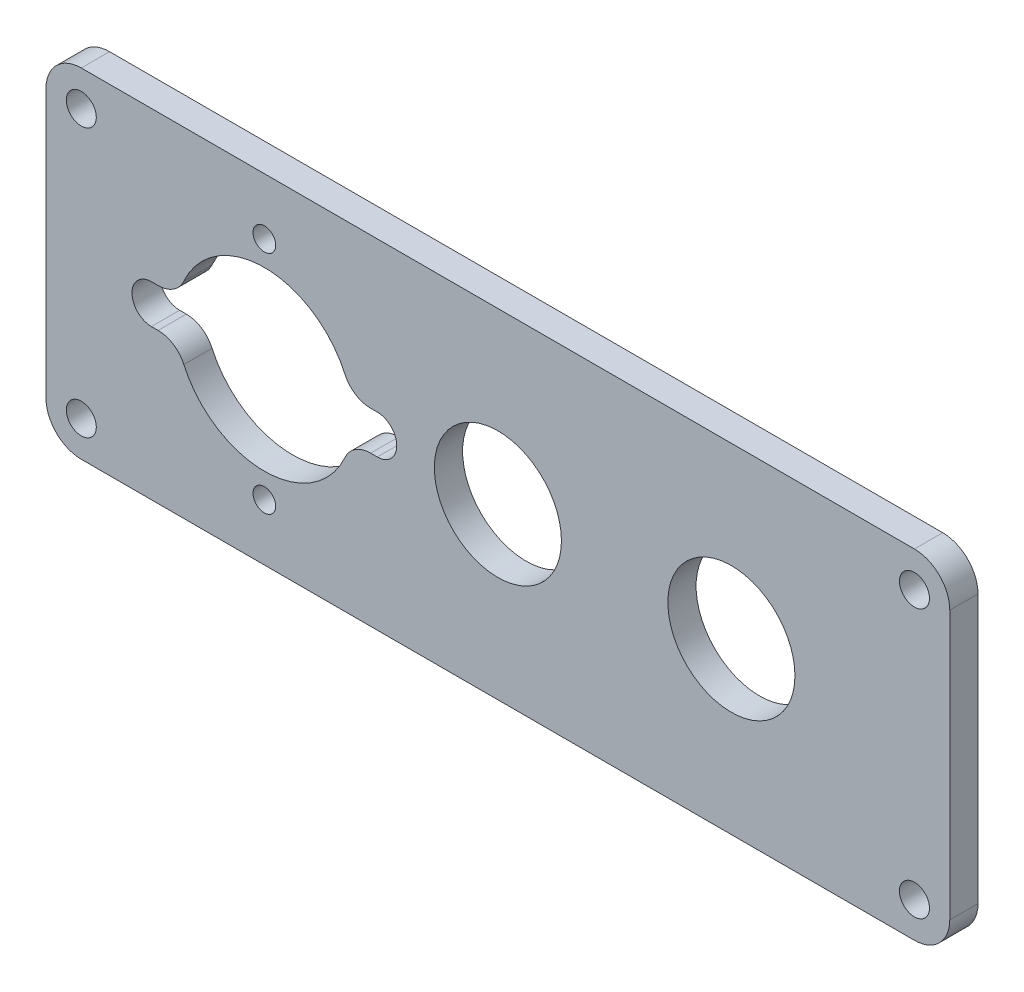
ISO-10303-21;
HEADER;
FILE_DESCRIPTION(('STEP AP214'),'2;1');
FILE_NAME('part.step','',(''),(''),'','','');
FILE_SCHEMA(('AUTOMOTIVE_DESIGN { 1 0 10303 214 1 1 1 1 }'));
ENDSEC;
DATA;
#1=APPLICATION_CONTEXT('core data for automotive mechanical design processes');
#2=APPLICATION_PROTOCOL_DEFINITION('international standard','automotive_design',2000,#1);
#3=PRODUCT_CONTEXT('',#1,'mechanical');
#4=PRODUCT('Part','Part','',(#3));
#5=PRODUCT_RELATED_PRODUCT_CATEGORY('part','',(#4));
#6=PRODUCT_DEFINITION_FORMATION('','',#4);
#7=PRODUCT_DEFINITION_CONTEXT('part definition',#1,'design');
#8=PRODUCT_DEFINITION('design','',#6,#7);
#9=PRODUCT_DEFINITION_SHAPE('','',#8);
#10=(LENGTH_UNIT() NAMED_UNIT(*) SI_UNIT(.MILLI.,.METRE.));
#11=(NAMED_UNIT(*) PLANE_ANGLE_UNIT() SI_UNIT($,.RADIAN.));
#12=(NAMED_UNIT(*) SI_UNIT($,.STERADIAN.) SOLID_ANGLE_UNIT());
#13=UNCERTAINTY_MEASURE_WITH_UNIT(LENGTH_MEASURE(1.E-05),#10,'distance_accuracy_value','');
#14=(GEOMETRIC_REPRESENTATION_CONTEXT(3) GLOBAL_UNCERTAINTY_ASSIGNED_CONTEXT((#13)) GLOBAL_UNIT_ASSIGNED_CONTEXT((#10,
#11,#12)) REPRESENTATION_CONTEXT('',''));
#15=CARTESIAN_POINT('',(0.,0.,0.));
#16=DIRECTION('',(0.,0.,1.));
#17=DIRECTION('',(1.,0.,0.));
#18=AXIS2_PLACEMENT_3D('',#15,#16,#17);
#19=CARTESIAN_POINT('',(-93.6625,-30.1625,6.35));
#20=DIRECTION('',(0.,0.,-1.));
#21=DIRECTION('',(-1.,0.,0.));
#22=AXIS2_PLACEMENT_3D('',#19,#20,#21);
#23=PLANE('',#22);
#24=CARTESIAN_POINT('',(-93.6625,-30.1625,6.35));
#25=DIRECTION('',(0.,0.,1.));
#26=DIRECTION('',(1.,0.,0.));
#27=AXIS2_PLACEMENT_3D('',#24,#25,#26);
#28=CIRCLE('',#27,3.3734375);
#29=CARTESIAN_POINT('',(-90.2890625,-30.1625,6.35));
#30=VERTEX_POINT('',#29);
#31=EDGE_CURVE('E317',#30,#30,#28,.T.);
#32=ORIENTED_EDGE('',*,*,#31,.F.);
#33=EDGE_LOOP('',(#32));
#34=FACE_BOUND('',#33,.T.);
#35=CARTESIAN_POINT('',(93.6625,-30.1625,6.35));
#36=DIRECTION('',(0.,0.,1.));
#37=DIRECTION('',(1.,0.,0.));
#38=AXIS2_PLACEMENT_3D('',#35,#36,#37);
#39=CIRCLE('',#38,3.3734375);
#40=CARTESIAN_POINT('',(97.0359375,-30.1625,6.35));
#41=VERTEX_POINT('',#40);
#42=EDGE_CURVE('E325',#41,#41,#39,.T.);
#43=ORIENTED_EDGE('',*,*,#42,.F.);
#44=EDGE_LOOP('',(#43));
#45=FACE_BOUND('',#44,.T.);
#46=CARTESIAN_POINT('',(93.6625,30.1625,6.35));
#47=DIRECTION('',(0.,0.,1.));
#48=DIRECTION('',(1.,0.,0.));
#49=AXIS2_PLACEMENT_3D('',#46,#47,#48);
#50=CIRCLE('',#49,3.3734375);
#51=CARTESIAN_POINT('',(97.0359375,30.1625,6.35));
#52=VERTEX_POINT('',#51);
#53=EDGE_CURVE('E333',#52,#52,#50,.T.);
#54=ORIENTED_EDGE('',*,*,#53,.F.);
#55=EDGE_LOOP('',(#54));
#56=FACE_BOUND('',#55,.T.);
#57=CARTESIAN_POINT('',(-93.6625,30.1625,6.35));
#58=DIRECTION('',(0.,0.,1.));
#59=DIRECTION('',(1.,0.,0.));
#60=AXIS2_PLACEMENT_3D('',#57,#58,#59);
#61=CIRCLE('',#60,3.3734375);
#62=CARTESIAN_POINT('',(-90.2890625,30.1625,6.35));
#63=VERTEX_POINT('',#62);
#64=EDGE_CURVE('E341',#63,#63,#61,.T.);
#65=ORIENTED_EDGE('',*,*,#64,.F.);
#66=EDGE_LOOP('',(#65));
#67=FACE_BOUND('',#66,.T.);
#68=CARTESIAN_POINT('',(52.5018,0.,6.35));
#69=DIRECTION('',(0.,0.,1.));
#70=DIRECTION('',(1.,0.,0.));
#71=AXIS2_PLACEMENT_3D('',#68,#69,#70);
#72=CIRCLE('',#71,14.2875);
#73=CARTESIAN_POINT('',(66.7893,0.,6.35));
#74=VERTEX_POINT('',#73);
#75=EDGE_CURVE('E349',#74,#74,#72,.T.);
#76=ORIENTED_EDGE('',*,*,#75,.F.);
#77=EDGE_LOOP('',(#76));
#78=FACE_BOUND('',#77,.T.);
#79=CARTESIAN_POINT('',(0.,0.,6.35));
#80=DIRECTION('',(0.,0.,1.));
#81=DIRECTION('',(1.,0.,0.));
#82=AXIS2_PLACEMENT_3D('',#79,#80,#81);
#83=CIRCLE('',#82,14.2875);
#84=CARTESIAN_POINT('',(14.2875,0.,6.35));
#85=VERTEX_POINT('',#84);
#86=EDGE_CURVE('E357',#85,#85,#83,.T.);
#87=ORIENTED_EDGE('',*,*,#86,.F.);
#88=EDGE_LOOP('',(#87));
#89=FACE_BOUND('',#88,.T.);
#90=CARTESIAN_POINT('',(-93.6625,-30.1625,6.35));
#91=DIRECTION('',(0.,0.,1.));
#92=DIRECTION('',(-1.,0.,0.));
#93=AXIS2_PLACEMENT_3D('',#90,#91,#92);
#94=CIRCLE('',#93,7.9375);
#95=CARTESIAN_POINT('',(-101.6,-30.1625,6.35));
#96=VERTEX_POINT('',#95);
#97=CARTESIAN_POINT('',(-93.6625,-38.1,6.35));
#98=VERTEX_POINT('',#97);
#99=EDGE_CURVE('E365',#96,#98,#94,.T.);
#100=ORIENTED_EDGE('',*,*,#99,.T.);
#101=DIRECTION('',(1.,0.,0.));
#102=VECTOR('',#101,1.);
#103=CARTESIAN_POINT('',(-93.6625,-38.1,6.35));
#104=LINE('',#103,#102);
#105=CARTESIAN_POINT('',(93.6625,-38.1,6.35));
#106=VERTEX_POINT('',#105);
#107=EDGE_CURVE('E369',#98,#106,#104,.T.);
#108=ORIENTED_EDGE('',*,*,#107,.T.);
#109=CARTESIAN_POINT('',(93.6625,-30.1625,6.35));
#110=DIRECTION('',(0.,0.,1.));
#111=DIRECTION('',(1.,0.,0.));
#112=AXIS2_PLACEMENT_3D('',#109,#110,#111);
#113=CIRCLE('',#112,7.93750000000001);
#114=CARTESIAN_POINT('',(101.6,-30.1625,6.35));
#115=VERTEX_POINT('',#114);
#116=EDGE_CURVE('E373',#106,#115,#113,.T.);
#117=ORIENTED_EDGE('',*,*,#116,.T.);
#118=DIRECTION('',(0.,1.,0.));
#119=VECTOR('',#118,1.);
#120=CARTESIAN_POINT('',(101.6,-30.1625,6.35));
#121=LINE('',#120,#119);
#122=CARTESIAN_POINT('',(101.6,30.1625,6.35));
#123=VERTEX_POINT('',#122);
#124=EDGE_CURVE('E376',#115,#123,#121,.T.);
#125=ORIENTED_EDGE('',*,*,#124,.T.);
#126=CARTESIAN_POINT('',(93.6625,30.1625,6.35));
#127=DIRECTION('',(0.,0.,1.));
#128=DIRECTION('',(-1.,0.,0.));
#129=AXIS2_PLACEMENT_3D('',#126,#127,#128);
#130=CIRCLE('',#129,7.93750000000001);
#131=CARTESIAN_POINT('',(93.6625,38.1,6.35));
#132=VERTEX_POINT('',#131);
#133=EDGE_CURVE('E379',#123,#132,#130,.T.);
#134=ORIENTED_EDGE('',*,*,#133,.T.);
#135=DIRECTION('',(-1.,0.,0.));
#136=VECTOR('',#135,1.);
#137=CARTESIAN_POINT('',(-93.6625,38.1,6.35));
#138=LINE('',#137,#136);
#139=CARTESIAN_POINT('',(-93.6625,38.1,6.35));
#140=VERTEX_POINT('',#139);
#141=EDGE_CURVE('E382',#132,#140,#138,.T.);
#142=ORIENTED_EDGE('',*,*,#141,.T.);
#143=CARTESIAN_POINT('',(-93.6625,30.1625,6.35));
#144=DIRECTION('',(0.,0.,1.));
#145=DIRECTION('',(-1.,0.,0.));
#146=AXIS2_PLACEMENT_3D('',#143,#144,#145);
#147=CIRCLE('',#146,7.9375);
#148=CARTESIAN_POINT('',(-101.6,30.1625,6.35));
#149=VERTEX_POINT('',#148);
#150=EDGE_CURVE('E385',#140,#149,#147,.T.);
#151=ORIENTED_EDGE('',*,*,#150,.T.);
#152=DIRECTION('',(0.,-1.,0.));
#153=VECTOR('',#152,1.);
#154=CARTESIAN_POINT('',(-101.6,-30.1625,6.35));
#155=LINE('',#154,#153);
#156=EDGE_CURVE('E388',#149,#96,#155,.T.);
#157=ORIENTED_EDGE('',*,*,#156,.T.);
#158=EDGE_LOOP('',(#100,#108,#117,#125,#134,#142,#151,#157));
#159=FACE_BOUND('',#158,.T.);
#160=CARTESIAN_POINT('',(-28.601593607115,-10.7188,6.35));
#161=DIRECTION('',(0.,0.,-1.));
#162=DIRECTION('',(1.,0.,0.));
#163=AXIS2_PLACEMENT_3D('',#160,#161,#162);
#164=CIRCLE('',#163,6.35);
#165=CARTESIAN_POINT('',(-34.3955830356932,-8.12030303030303,6.35));
#166=VERTEX_POINT('',#165);
#167=CARTESIAN_POINT('',(-28.601593607115,-4.36879999999999,6.35));
#168=VERTEX_POINT('',#167);
#169=EDGE_CURVE('E184',#166,#168,#164,.T.);
#170=ORIENTED_EDGE('',*,*,#169,.F.);
#171=CARTESIAN_POINT('',(-52.5018,0.,6.35));
#172=DIRECTION('',(0.,0.,1.));
#173=DIRECTION('',(1.,0.,0.));
#174=AXIS2_PLACEMENT_3D('',#171,#172,#173);
#175=CIRCLE('',#174,19.84375);
#176=CARTESIAN_POINT('',(-70.6080169643068,-8.12030303030303,6.35));
#177=VERTEX_POINT('',#176);
#178=EDGE_CURVE('E240',#177,#166,#175,.T.);
#179=ORIENTED_EDGE('',*,*,#178,.F.);
#180=CARTESIAN_POINT('',(-76.402006392885,-10.7188,6.35));
#181=DIRECTION('',(0.,0.,-1.));
#182=DIRECTION('',(-1.,0.,0.));
#183=AXIS2_PLACEMENT_3D('',#180,#181,#182);
#184=CIRCLE('',#183,6.35);
#185=CARTESIAN_POINT('',(-76.402006392885,-4.36880000000001,6.35));
#186=VERTEX_POINT('',#185);
#187=EDGE_CURVE('E237',#186,#177,#184,.T.);
#188=ORIENTED_EDGE('',*,*,#187,.F.);
#189=DIRECTION('',(1.,0.,0.));
#190=VECTOR('',#189,1.);
#191=CARTESIAN_POINT('',(-76.402006392885,-4.36880000000001,6.35));
#192=LINE('',#191,#190);
#193=CARTESIAN_POINT('',(-77.9018,-4.3688,6.35));
#194=VERTEX_POINT('',#193);
#195=EDGE_CURVE('E234',#194,#186,#192,.T.);
#196=ORIENTED_EDGE('',*,*,#195,.F.);
#197=CARTESIAN_POINT('',(-77.9018,0.,6.35));
#198=DIRECTION('',(0.,0.,1.));
#199=DIRECTION('',(1.,0.,0.));
#200=AXIS2_PLACEMENT_3D('',#197,#198,#199);
#201=CIRCLE('',#200,4.3688);
#202=CARTESIAN_POINT('',(-77.9018,4.3688,6.35));
#203=VERTEX_POINT('',#202);
#204=EDGE_CURVE('E231',#203,#194,#201,.T.);
#205=ORIENTED_EDGE('',*,*,#204,.F.);
#206=DIRECTION('',(-1.,0.,0.));
#207=VECTOR('',#206,1.);
#208=CARTESIAN_POINT('',(-76.402006392885,4.36879999999999,6.35));
#209=LINE('',#208,#207);
#210=CARTESIAN_POINT('',(-76.402006392885,4.36879999999999,6.35));
#211=VERTEX_POINT('',#210);
#212=EDGE_CURVE('E228',#211,#203,#209,.T.);
#213=ORIENTED_EDGE('',*,*,#212,.F.);
#214=CARTESIAN_POINT('',(-76.402006392885,10.7188,6.35));
#215=DIRECTION('',(0.,0.,-1.));
#216=DIRECTION('',(1.,0.,0.));
#217=AXIS2_PLACEMENT_3D('',#214,#215,#216);
#218=CIRCLE('',#217,6.34999999999999);
#219=CARTESIAN_POINT('',(-70.6080169643068,8.12030303030302,6.35));
#220=VERTEX_POINT('',#219);
#221=EDGE_CURVE('E225',#220,#211,#218,.T.);
#222=ORIENTED_EDGE('',*,*,#221,.F.);
#223=CARTESIAN_POINT('',(-52.5018,0.,6.35));
#224=DIRECTION('',(0.,0.,1.));
#225=DIRECTION('',(1.,0.,0.));
#226=AXIS2_PLACEMENT_3D('',#223,#224,#225);
#227=CIRCLE('',#226,19.84375);
#228=CARTESIAN_POINT('',(-34.3955830356932,8.12030303030304,6.35));
#229=VERTEX_POINT('',#228);
#230=EDGE_CURVE('E222',#229,#220,#227,.T.);
#231=ORIENTED_EDGE('',*,*,#230,.F.);
#232=CARTESIAN_POINT('',(-28.601593607115,10.7188,6.35));
#233=DIRECTION('',(0.,0.,-1.));
#234=DIRECTION('',(-1.,0.,0.));
#235=AXIS2_PLACEMENT_3D('',#232,#233,#234);
#236=CIRCLE('',#235,6.35);
#237=CARTESIAN_POINT('',(-28.601593607115,4.36880000000002,6.35));
#238=VERTEX_POINT('',#237);
#239=EDGE_CURVE('E219',#238,#229,#236,.T.);
#240=ORIENTED_EDGE('',*,*,#239,.F.);
#241=DIRECTION('',(-1.,0.,0.));
#242=VECTOR('',#241,1.);
#243=CARTESIAN_POINT('',(-28.601593607115,4.36880000000002,6.35));
#244=LINE('',#243,#242);
#245=CARTESIAN_POINT('',(-27.1018,4.3688,6.35));
#246=VERTEX_POINT('',#245);
#247=EDGE_CURVE('E213',#246,#238,#244,.T.);
#248=ORIENTED_EDGE('',*,*,#247,.F.);
#249=CARTESIAN_POINT('',(-27.1018,0.,6.35));
#250=DIRECTION('',(0.,0.,1.));
#251=DIRECTION('',(1.,0.,0.));
#252=AXIS2_PLACEMENT_3D('',#249,#250,#251);
#253=CIRCLE('',#252,4.3688);
#254=CARTESIAN_POINT('',(-27.1018,-4.3688,6.35));
#255=VERTEX_POINT('',#254);
#256=EDGE_CURVE('E208',#255,#246,#253,.T.);
#257=ORIENTED_EDGE('',*,*,#256,.F.);
#258=DIRECTION('',(1.,0.,0.));
#259=VECTOR('',#258,1.);
#260=CARTESIAN_POINT('',(-27.1018,-4.3688,6.35));
#261=LINE('',#260,#259);
#262=EDGE_CURVE('E193',#168,#255,#261,.T.);
#263=ORIENTED_EDGE('',*,*,#262,.F.);
#264=EDGE_LOOP('',(#170,#179,#188,#196,#205,#213,#222,#231,#240,#248,#257,#263));
#265=FACE_BOUND('',#264,.T.);
#266=CARTESIAN_POINT('',(-52.5018,25.4,6.35));
#267=DIRECTION('',(0.,0.,1.));
#268=DIRECTION('',(1.,0.,0.));
#269=AXIS2_PLACEMENT_3D('',#266,#267,#268);
#270=CIRCLE('',#269,2.55270000000001);
#271=CARTESIAN_POINT('',(-49.9491,25.4,6.35));
#272=VERTEX_POINT('',#271);
#273=EDGE_CURVE('E245',#272,#272,#270,.T.);
#274=ORIENTED_EDGE('',*,*,#273,.F.);
#275=EDGE_LOOP('',(#274));
#276=FACE_BOUND('',#275,.T.);
#277=CARTESIAN_POINT('',(-52.5018,-25.4,6.35));
#278=DIRECTION('',(0.,0.,1.));
#279=DIRECTION('',(1.,0.,0.));
#280=AXIS2_PLACEMENT_3D('',#277,#278,#279);
#281=CIRCLE('',#280,2.5527);
#282=CARTESIAN_POINT('',(-49.9491,-25.4,6.35));
#283=VERTEX_POINT('',#282);
#284=EDGE_CURVE('E593',#283,#283,#281,.T.);
#285=ORIENTED_EDGE('',*,*,#284,.F.);
#286=EDGE_LOOP('',(#285));
#287=FACE_BOUND('',#286,.T.);
#288=ADVANCED_FACE('F46',(#34,#45,#56,#67,#78,#89,#159,#265,#276,#287),#23,.F.);
#289=CARTESIAN_POINT('',(-93.6625,-30.1625,0.));
#290=DIRECTION('',(0.,0.,-1.));
#291=DIRECTION('',(-1.,0.,0.));
#292=AXIS2_PLACEMENT_3D('',#289,#290,#291);
#293=PLANE('',#292);
#294=CARTESIAN_POINT('',(-52.5018,25.4,0.));
#295=DIRECTION('',(0.,0.,1.));
#296=DIRECTION('',(1.,0.,0.));
#297=AXIS2_PLACEMENT_3D('',#294,#295,#296);
#298=CIRCLE('',#297,2.55270000000001);
#299=CARTESIAN_POINT('',(-49.9491,25.4,0.));
#300=VERTEX_POINT('',#299);
#301=EDGE_CURVE('E602',#300,#300,#298,.T.);
#302=ORIENTED_EDGE('',*,*,#301,.T.);
#303=EDGE_LOOP('',(#302));
#304=FACE_BOUND('',#303,.T.);
#305=CARTESIAN_POINT('',(93.6625,-30.1625,0.));
#306=DIRECTION('',(0.,0.,1.));
#307=DIRECTION('',(1.,0.,0.));
#308=AXIS2_PLACEMENT_3D('',#305,#306,#307);
#309=CIRCLE('',#308,3.3734375);
#310=CARTESIAN_POINT('',(97.0359375,-30.1625,0.));
#311=VERTEX_POINT('',#310);
#312=EDGE_CURVE('E321',#311,#311,#309,.T.);
#313=ORIENTED_EDGE('',*,*,#312,.T.);
#314=EDGE_LOOP('',(#313));
#315=FACE_BOUND('',#314,.T.);
#316=CARTESIAN_POINT('',(-93.6625,30.1625,0.));
#317=DIRECTION('',(0.,0.,1.));
#318=DIRECTION('',(1.,0.,0.));
#319=AXIS2_PLACEMENT_3D('',#316,#317,#318);
#320=CIRCLE('',#319,3.3734375);
#321=CARTESIAN_POINT('',(-90.2890625,30.1625,0.));
#322=VERTEX_POINT('',#321);
#323=EDGE_CURVE('E337',#322,#322,#320,.T.);
#324=ORIENTED_EDGE('',*,*,#323,.T.);
#325=EDGE_LOOP('',(#324));
#326=FACE_BOUND('',#325,.T.);
#327=CARTESIAN_POINT('',(0.,0.,0.));
#328=DIRECTION('',(0.,0.,1.));
#329=DIRECTION('',(1.,0.,0.));
#330=AXIS2_PLACEMENT_3D('',#327,#328,#329);
#331=CIRCLE('',#330,14.2875);
#332=CARTESIAN_POINT('',(14.2875,0.,0.));
#333=VERTEX_POINT('',#332);
#334=EDGE_CURVE('E353',#333,#333,#331,.T.);
#335=ORIENTED_EDGE('',*,*,#334,.T.);
#336=EDGE_LOOP('',(#335));
#337=FACE_BOUND('',#336,.T.);
#338=CARTESIAN_POINT('',(-93.6625,-30.1625,0.));
#339=DIRECTION('',(0.,0.,1.));
#340=DIRECTION('',(-1.,0.,0.));
#341=AXIS2_PLACEMENT_3D('',#338,#339,#340);
#342=CIRCLE('',#341,7.9375);
#343=CARTESIAN_POINT('',(-101.6,-30.1625,0.));
#344=VERTEX_POINT('',#343);
#345=CARTESIAN_POINT('',(-93.6625,-38.1,0.));
#346=VERTEX_POINT('',#345);
#347=EDGE_CURVE('E361',#344,#346,#342,.T.);
#348=ORIENTED_EDGE('',*,*,#347,.F.);
#349=DIRECTION('',(0.,-1.,0.));
#350=VECTOR('',#349,1.);
#351=CARTESIAN_POINT('',(-101.6,-30.1625,0.));
#352=LINE('',#351,#350);
#353=CARTESIAN_POINT('',(-101.6,30.1625,0.));
#354=VERTEX_POINT('',#353);
#355=EDGE_CURVE('E370',#354,#344,#352,.T.);
#356=ORIENTED_EDGE('',*,*,#355,.F.);
#357=CARTESIAN_POINT('',(-93.6625,30.1625,0.));
#358=DIRECTION('',(0.,0.,1.));
#359=DIRECTION('',(-1.,0.,0.));
#360=AXIS2_PLACEMENT_3D('',#357,#358,#359);
#361=CIRCLE('',#360,7.9375);
#362=CARTESIAN_POINT('',(-93.6625,38.1,0.));
#363=VERTEX_POINT('',#362);
#364=EDGE_CURVE('E410',#363,#354,#361,.T.);
#365=ORIENTED_EDGE('',*,*,#364,.F.);
#366=DIRECTION('',(-1.,0.,0.));
#367=VECTOR('',#366,1.);
#368=CARTESIAN_POINT('',(-93.6625,38.1,0.));
#369=LINE('',#368,#367);
#370=CARTESIAN_POINT('',(93.6625,38.1,0.));
#371=VERTEX_POINT('',#370);
#372=EDGE_CURVE('E407',#371,#363,#369,.T.);
#373=ORIENTED_EDGE('',*,*,#372,.F.);
#374=CARTESIAN_POINT('',(93.6625,30.1625,0.));
#375=DIRECTION('',(0.,0.,1.));
#376=DIRECTION('',(-1.,0.,0.));
#377=AXIS2_PLACEMENT_3D('',#374,#375,#376);
#378=CIRCLE('',#377,7.93750000000001);
#379=CARTESIAN_POINT('',(101.6,30.1625,0.));
#380=VERTEX_POINT('',#379);
#381=EDGE_CURVE('E404',#380,#371,#378,.T.);
#382=ORIENTED_EDGE('',*,*,#381,.F.);
#383=DIRECTION('',(0.,1.,0.));
#384=VECTOR('',#383,1.);
#385=CARTESIAN_POINT('',(101.6,-30.1625,0.));
#386=LINE('',#385,#384);
#387=CARTESIAN_POINT('',(101.6,-30.1625,0.));
#388=VERTEX_POINT('',#387);
#389=EDGE_CURVE('E401',#388,#380,#386,.T.);
#390=ORIENTED_EDGE('',*,*,#389,.F.);
#391=CARTESIAN_POINT('',(93.6625,-30.1625,0.));
#392=DIRECTION('',(0.,0.,1.));
#393=DIRECTION('',(1.,0.,0.));
#394=AXIS2_PLACEMENT_3D('',#391,#392,#393);
#395=CIRCLE('',#394,7.93750000000001);
#396=CARTESIAN_POINT('',(93.6625,-38.1,0.));
#397=VERTEX_POINT('',#396);
#398=EDGE_CURVE('E398',#397,#388,#395,.T.);
#399=ORIENTED_EDGE('',*,*,#398,.F.);
#400=DIRECTION('',(1.,0.,0.));
#401=VECTOR('',#400,1.);
#402=CARTESIAN_POINT('',(-93.6625,-38.1,0.));
#403=LINE('',#402,#401);
#404=EDGE_CURVE('E395',#346,#397,#403,.T.);
#405=ORIENTED_EDGE('',*,*,#404,.F.);
#406=EDGE_LOOP('',(#348,#356,#365,#373,#382,#390,#399,#405));
#407=FACE_BOUND('',#406,.T.);
#408=CARTESIAN_POINT('',(52.5018,0.,0.));
#409=DIRECTION('',(0.,0.,1.));
#410=DIRECTION('',(1.,0.,0.));
#411=AXIS2_PLACEMENT_3D('',#408,#409,#410);
#412=CIRCLE('',#411,14.2875);
#413=CARTESIAN_POINT('',(66.7893,0.,0.));
#414=VERTEX_POINT('',#413);
#415=EDGE_CURVE('E345',#414,#414,#412,.T.);
#416=ORIENTED_EDGE('',*,*,#415,.T.);
#417=EDGE_LOOP('',(#416));
#418=FACE_BOUND('',#417,.T.);
#419=CARTESIAN_POINT('',(93.6625,30.1625,0.));
#420=DIRECTION('',(0.,0.,1.));
#421=DIRECTION('',(1.,0.,0.));
#422=AXIS2_PLACEMENT_3D('',#419,#420,#421);
#423=CIRCLE('',#422,3.3734375);
#424=CARTESIAN_POINT('',(97.0359375,30.1625,0.));
#425=VERTEX_POINT('',#424);
#426=EDGE_CURVE('E329',#425,#425,#423,.T.);
#427=ORIENTED_EDGE('',*,*,#426,.T.);
#428=EDGE_LOOP('',(#427));
#429=FACE_BOUND('',#428,.T.);
#430=CARTESIAN_POINT('',(-93.6625,-30.1625,0.));
#431=DIRECTION('',(0.,0.,1.));
#432=DIRECTION('',(1.,0.,0.));
#433=AXIS2_PLACEMENT_3D('',#430,#431,#432);
#434=CIRCLE('',#433,3.3734375);
#435=CARTESIAN_POINT('',(-90.2890625,-30.1625,0.));
#436=VERTEX_POINT('',#435);
#437=EDGE_CURVE('E202',#436,#436,#434,.T.);
#438=ORIENTED_EDGE('',*,*,#437,.T.);
#439=EDGE_LOOP('',(#438));
#440=FACE_BOUND('',#439,.T.);
#441=CARTESIAN_POINT('',(-52.5018,0.,0.));
#442=DIRECTION('',(0.,0.,1.));
#443=DIRECTION('',(1.,0.,0.));
#444=AXIS2_PLACEMENT_3D('',#441,#442,#443);
#445=CIRCLE('',#444,19.84375);
#446=CARTESIAN_POINT('',(-70.6080169643068,-8.12030303030303,0.));
#447=VERTEX_POINT('',#446);
#448=CARTESIAN_POINT('',(-34.3955830356932,-8.12030303030303,0.));
#449=VERTEX_POINT('',#448);
#450=EDGE_CURVE('E194',#447,#449,#445,.T.);
#451=ORIENTED_EDGE('',*,*,#450,.T.);
#452=CARTESIAN_POINT('',(-28.601593607115,-10.7188,0.));
#453=DIRECTION('',(0.,0.,-1.));
#454=DIRECTION('',(1.,0.,0.));
#455=AXIS2_PLACEMENT_3D('',#452,#453,#454);
#456=CIRCLE('',#455,6.35);
#457=CARTESIAN_POINT('',(-28.601593607115,-4.36879999999999,0.));
#458=VERTEX_POINT('',#457);
#459=EDGE_CURVE('E70',#449,#458,#456,.T.);
#460=ORIENTED_EDGE('',*,*,#459,.T.);
#461=DIRECTION('',(1.,0.,0.));
#462=VECTOR('',#461,1.);
#463=CARTESIAN_POINT('',(-27.1018,-4.3688,0.));
#464=LINE('',#463,#462);
#465=CARTESIAN_POINT('',(-27.1018,-4.3688,0.));
#466=VERTEX_POINT('',#465);
#467=EDGE_CURVE('E200',#458,#466,#464,.T.);
#468=ORIENTED_EDGE('',*,*,#467,.T.);
#469=CARTESIAN_POINT('',(-27.1018,0.,0.));
#470=DIRECTION('',(0.,0.,1.));
#471=DIRECTION('',(1.,0.,0.));
#472=AXIS2_PLACEMENT_3D('',#469,#470,#471);
#473=CIRCLE('',#472,4.3688);
#474=CARTESIAN_POINT('',(-27.1018,4.3688,0.));
#475=VERTEX_POINT('',#474);
#476=EDGE_CURVE('E248',#466,#475,#473,.T.);
#477=ORIENTED_EDGE('',*,*,#476,.T.);
#478=DIRECTION('',(-1.,0.,0.));
#479=VECTOR('',#478,1.);
#480=CARTESIAN_POINT('',(-28.601593607115,4.36880000000002,0.));
#481=LINE('',#480,#479);
#482=CARTESIAN_POINT('',(-28.601593607115,4.36880000000002,0.));
#483=VERTEX_POINT('',#482);
#484=EDGE_CURVE('E252',#475,#483,#481,.T.);
#485=ORIENTED_EDGE('',*,*,#484,.T.);
#486=CARTESIAN_POINT('',(-28.601593607115,10.7188,0.));
#487=DIRECTION('',(0.,0.,-1.));
#488=DIRECTION('',(-1.,0.,0.));
#489=AXIS2_PLACEMENT_3D('',#486,#487,#488);
#490=CIRCLE('',#489,6.35);
#491=CARTESIAN_POINT('',(-34.3955830356932,8.12030303030304,0.));
#492=VERTEX_POINT('',#491);
#493=EDGE_CURVE('E256',#483,#492,#490,.T.);
#494=ORIENTED_EDGE('',*,*,#493,.T.);
#495=CARTESIAN_POINT('',(-52.5018,0.,0.));
#496=DIRECTION('',(0.,0.,1.));
#497=DIRECTION('',(1.,0.,0.));
#498=AXIS2_PLACEMENT_3D('',#495,#496,#497);
#499=CIRCLE('',#498,19.84375);
#500=CARTESIAN_POINT('',(-70.6080169643068,8.12030303030302,0.));
#501=VERTEX_POINT('',#500);
#502=EDGE_CURVE('E260',#492,#501,#499,.T.);
#503=ORIENTED_EDGE('',*,*,#502,.T.);
#504=CARTESIAN_POINT('',(-76.402006392885,10.7188,0.));
#505=DIRECTION('',(0.,0.,-1.));
#506=DIRECTION('',(1.,0.,0.));
#507=AXIS2_PLACEMENT_3D('',#504,#505,#506);
#508=CIRCLE('',#507,6.34999999999999);
#509=CARTESIAN_POINT('',(-76.402006392885,4.36879999999999,0.));
#510=VERTEX_POINT('',#509);
#511=EDGE_CURVE('E264',#501,#510,#508,.T.);
#512=ORIENTED_EDGE('',*,*,#511,.T.);
#513=DIRECTION('',(-1.,0.,0.));
#514=VECTOR('',#513,1.);
#515=CARTESIAN_POINT('',(-76.402006392885,4.36879999999999,0.));
#516=LINE('',#515,#514);
#517=CARTESIAN_POINT('',(-77.9018,4.3688,0.));
#518=VERTEX_POINT('',#517);
#519=EDGE_CURVE('E268',#510,#518,#516,.T.);
#520=ORIENTED_EDGE('',*,*,#519,.T.);
#521=CARTESIAN_POINT('',(-77.9018,0.,0.));
#522=DIRECTION('',(0.,0.,1.));
#523=DIRECTION('',(1.,0.,0.));
#524=AXIS2_PLACEMENT_3D('',#521,#522,#523);
#525=CIRCLE('',#524,4.3688);
#526=CARTESIAN_POINT('',(-77.9018,-4.3688,0.));
#527=VERTEX_POINT('',#526);
#528=EDGE_CURVE('E272',#518,#527,#525,.T.);
#529=ORIENTED_EDGE('',*,*,#528,.T.);
#530=DIRECTION('',(1.,0.,0.));
#531=VECTOR('',#530,1.);
#532=CARTESIAN_POINT('',(-76.402006392885,-4.36880000000001,0.));
#533=LINE('',#532,#531);
#534=CARTESIAN_POINT('',(-76.402006392885,-4.36880000000001,0.));
#535=VERTEX_POINT('',#534);
#536=EDGE_CURVE('E276',#527,#535,#533,.T.);
#537=ORIENTED_EDGE('',*,*,#536,.T.);
#538=CARTESIAN_POINT('',(-76.402006392885,-10.7188,0.));
#539=DIRECTION('',(0.,0.,-1.));
#540=DIRECTION('',(-1.,0.,0.));
#541=AXIS2_PLACEMENT_3D('',#538,#539,#540);
#542=CIRCLE('',#541,6.35);
#543=EDGE_CURVE('E280',#535,#447,#542,.T.);
#544=ORIENTED_EDGE('',*,*,#543,.T.);
#545=EDGE_LOOP('',(#451,#460,#468,#477,#485,#494,#503,#512,#520,#529,#537,#544));
#546=FACE_BOUND('',#545,.T.);
#547=CARTESIAN_POINT('',(-52.5018,-25.4,0.));
#548=DIRECTION('',(0.,0.,1.));
#549=DIRECTION('',(1.,0.,0.));
#550=AXIS2_PLACEMENT_3D('',#547,#548,#549);
#551=CIRCLE('',#550,2.5527);
#552=CARTESIAN_POINT('',(-49.9491,-25.4,0.));
#553=VERTEX_POINT('',#552);
#554=EDGE_CURVE('E596',#553,#553,#551,.T.);
#555=ORIENTED_EDGE('',*,*,#554,.T.);
#556=EDGE_LOOP('',(#555));
#557=FACE_BOUND('',#556,.T.);
#558=ADVANCED_FACE('F450',(#304,#315,#326,#337,#407,#418,#429,#440,#546,#557),#293,.T.);
#559=CARTESIAN_POINT('',(-93.6625,-30.1625,6.35));
#560=DIRECTION('',(0.,0.,-1.));
#561=DIRECTION('',(-1.,0.,0.));
#562=AXIS2_PLACEMENT_3D('',#559,#560,#561);
#563=CYLINDRICAL_SURFACE('',#562,7.9375);
#564=ORIENTED_EDGE('',*,*,#347,.T.);
#565=DIRECTION('',(0.,0.,-1.));
#566=VECTOR('',#565,1.);
#567=CARTESIAN_POINT('',(-93.6625,-38.1,6.35));
#568=LINE('',#567,#566);
#569=EDGE_CURVE('E13',#98,#346,#568,.T.);
#570=ORIENTED_EDGE('',*,*,#569,.F.);
#571=ORIENTED_EDGE('',*,*,#99,.F.);
#572=DIRECTION('',(0.,0.,-1.));
#573=VECTOR('',#572,1.);
#574=CARTESIAN_POINT('',(-101.6,-30.1625,6.35));
#575=LINE('',#574,#573);
#576=EDGE_CURVE('E391',#96,#344,#575,.T.);
#577=ORIENTED_EDGE('',*,*,#576,.T.);
#578=EDGE_LOOP('',(#564,#570,#571,#577));
#579=FACE_BOUND('',#578,.T.);
#580=ADVANCED_FACE('F48',(#579),#563,.T.);
#581=CARTESIAN_POINT('',(-93.6625,-38.1,6.35));
#582=DIRECTION('',(0.,1.,0.));
#583=DIRECTION('',(0.,0.,1.));
#584=AXIS2_PLACEMENT_3D('',#581,#582,#583);
#585=PLANE('',#584);
#586=ORIENTED_EDGE('',*,*,#404,.T.);
#587=DIRECTION('',(0.,0.,-1.));
#588=VECTOR('',#587,1.);
#589=CARTESIAN_POINT('',(93.6625,-38.1,6.35));
#590=LINE('',#589,#588);
#591=EDGE_CURVE('E55',#106,#397,#590,.T.);
#592=ORIENTED_EDGE('',*,*,#591,.F.);
#593=ORIENTED_EDGE('',*,*,#107,.F.);
#594=ORIENTED_EDGE('',*,*,#569,.T.);
#595=EDGE_LOOP('',(#586,#592,#593,#594));
#596=FACE_BOUND('',#595,.T.);
#597=ADVANCED_FACE('F467',(#596),#585,.F.);
#598=CARTESIAN_POINT('',(93.6625,-30.1625,6.35));
#599=DIRECTION('',(0.,0.,-1.));
#600=DIRECTION('',(-1.,0.,0.));
#601=AXIS2_PLACEMENT_3D('',#598,#599,#600);
#602=CYLINDRICAL_SURFACE('',#601,7.93750000000001);
#603=ORIENTED_EDGE('',*,*,#398,.T.);
#604=DIRECTION('',(0.,0.,-1.));
#605=VECTOR('',#604,1.);
#606=CARTESIAN_POINT('',(101.6,-30.1625,6.35));
#607=LINE('',#606,#605);
#608=EDGE_CURVE('E434',#115,#388,#607,.T.);
#609=ORIENTED_EDGE('',*,*,#608,.F.);
#610=ORIENTED_EDGE('',*,*,#116,.F.);
#611=ORIENTED_EDGE('',*,*,#591,.T.);
#612=EDGE_LOOP('',(#603,#609,#610,#611));
#613=FACE_BOUND('',#612,.T.);
#614=ADVANCED_FACE('F444',(#613),#602,.T.);
#615=CARTESIAN_POINT('',(101.6,-30.1625,6.35));
#616=DIRECTION('',(-1.,0.,0.));
#617=DIRECTION('',(0.,0.,1.));
#618=AXIS2_PLACEMENT_3D('',#615,#616,#617);
#619=PLANE('',#618);
#620=ORIENTED_EDGE('',*,*,#389,.T.);
#621=DIRECTION('',(0.,0.,-1.));
#622=VECTOR('',#621,1.);
#623=CARTESIAN_POINT('',(101.6,30.1625,6.35));
#624=LINE('',#623,#622);
#625=EDGE_CURVE('E430',#123,#380,#624,.T.);
#626=ORIENTED_EDGE('',*,*,#625,.F.);
#627=ORIENTED_EDGE('',*,*,#124,.F.);
#628=ORIENTED_EDGE('',*,*,#608,.T.);
#629=EDGE_LOOP('',(#620,#626,#627,#628));
#630=FACE_BOUND('',#629,.T.);
#631=ADVANCED_FACE('F456',(#630),#619,.F.);
#632=CARTESIAN_POINT('',(93.6625,30.1625,6.35));
#633=DIRECTION('',(0.,0.,-1.));
#634=DIRECTION('',(-1.,0.,0.));
#635=AXIS2_PLACEMENT_3D('',#632,#633,#634);
#636=CYLINDRICAL_SURFACE('',#635,7.93750000000001);
#637=ORIENTED_EDGE('',*,*,#381,.T.);
#638=DIRECTION('',(0.,0.,-1.));
#639=VECTOR('',#638,1.);
#640=CARTESIAN_POINT('',(93.6625,38.1,6.35));
#641=LINE('',#640,#639);
#642=EDGE_CURVE('E426',#132,#371,#641,.T.);
#643=ORIENTED_EDGE('',*,*,#642,.F.);
#644=ORIENTED_EDGE('',*,*,#133,.F.);
#645=ORIENTED_EDGE('',*,*,#625,.T.);
#646=EDGE_LOOP('',(#637,#643,#644,#645));
#647=FACE_BOUND('',#646,.T.);
#648=ADVANCED_FACE('F460',(#647),#636,.T.);
#649=CARTESIAN_POINT('',(-93.6625,38.1,6.35));
#650=DIRECTION('',(0.,-1.,0.));
#651=DIRECTION('',(0.,0.,-1.));
#652=AXIS2_PLACEMENT_3D('',#649,#650,#651);
#653=PLANE('',#652);
#654=ORIENTED_EDGE('',*,*,#372,.T.);
#655=DIRECTION('',(0.,0.,-1.));
#656=VECTOR('',#655,1.);
#657=CARTESIAN_POINT('',(-93.6625,38.1,6.35));
#658=LINE('',#657,#656);
#659=EDGE_CURVE('E422',#140,#363,#658,.T.);
#660=ORIENTED_EDGE('',*,*,#659,.F.);
#661=ORIENTED_EDGE('',*,*,#141,.F.);
#662=ORIENTED_EDGE('',*,*,#642,.T.);
#663=EDGE_LOOP('',(#654,#660,#661,#662));
#664=FACE_BOUND('',#663,.T.);
#665=ADVANCED_FACE('F480',(#664),#653,.F.);
#666=CARTESIAN_POINT('',(-93.6625,30.1625,6.35));
#667=DIRECTION('',(0.,0.,-1.));
#668=DIRECTION('',(-1.,0.,0.));
#669=AXIS2_PLACEMENT_3D('',#666,#667,#668);
#670=CYLINDRICAL_SURFACE('',#669,7.9375);
#671=ORIENTED_EDGE('',*,*,#364,.T.);
#672=DIRECTION('',(0.,0.,-1.));
#673=VECTOR('',#672,1.);
#674=CARTESIAN_POINT('',(-101.6,30.1625,6.35));
#675=LINE('',#674,#673);
#676=EDGE_CURVE('E418',#149,#354,#675,.T.);
#677=ORIENTED_EDGE('',*,*,#676,.F.);
#678=ORIENTED_EDGE('',*,*,#150,.F.);
#679=ORIENTED_EDGE('',*,*,#659,.T.);
#680=EDGE_LOOP('',(#671,#677,#678,#679));
#681=FACE_BOUND('',#680,.T.);
#682=ADVANCED_FACE('F478',(#681),#670,.T.);
#683=CARTESIAN_POINT('',(-101.6,-30.1625,6.35));
#684=DIRECTION('',(1.,0.,0.));
#685=DIRECTION('',(0.,0.,-1.));
#686=AXIS2_PLACEMENT_3D('',#683,#684,#685);
#687=PLANE('',#686);
#688=ORIENTED_EDGE('',*,*,#355,.T.);
#689=ORIENTED_EDGE('',*,*,#576,.F.);
#690=ORIENTED_EDGE('',*,*,#156,.F.);
#691=ORIENTED_EDGE('',*,*,#676,.T.);
#692=EDGE_LOOP('',(#688,#689,#690,#691));
#693=FACE_BOUND('',#692,.T.);
#694=ADVANCED_FACE('F473',(#693),#687,.F.);
#695=CARTESIAN_POINT('',(0.,0.,6.35));
#696=DIRECTION('',(0.,0.,-1.));
#697=DIRECTION('',(-1.,0.,0.));
#698=AXIS2_PLACEMENT_3D('',#695,#696,#697);
#699=CYLINDRICAL_SURFACE('',#698,14.2875);
#700=ORIENTED_EDGE('',*,*,#86,.T.);
#701=EDGE_LOOP('',(#700));
#702=FACE_BOUND('',#701,.T.);
#703=ORIENTED_EDGE('',*,*,#334,.F.);
#704=EDGE_LOOP('',(#703));
#705=FACE_BOUND('',#704,.T.);
#706=ADVANCED_FACE('F500',(#702,#705),#699,.F.);
#707=CARTESIAN_POINT('',(52.5018,0.,6.35));
#708=DIRECTION('',(0.,0.,-1.));
#709=DIRECTION('',(-1.,0.,0.));
#710=AXIS2_PLACEMENT_3D('',#707,#708,#709);
#711=CYLINDRICAL_SURFACE('',#710,14.2875);
#712=ORIENTED_EDGE('',*,*,#75,.T.);
#713=EDGE_LOOP('',(#712));
#714=FACE_BOUND('',#713,.T.);
#715=ORIENTED_EDGE('',*,*,#415,.F.);
#716=EDGE_LOOP('',(#715));
#717=FACE_BOUND('',#716,.T.);
#718=ADVANCED_FACE('F507',(#714,#717),#711,.F.);
#719=CARTESIAN_POINT('',(-93.6625,30.1625,6.35));
#720=DIRECTION('',(0.,0.,-1.));
#721=DIRECTION('',(-1.,0.,0.));
#722=AXIS2_PLACEMENT_3D('',#719,#720,#721);
#723=CYLINDRICAL_SURFACE('',#722,3.3734375);
#724=ORIENTED_EDGE('',*,*,#64,.T.);
#725=EDGE_LOOP('',(#724));
#726=FACE_BOUND('',#725,.T.);
#727=ORIENTED_EDGE('',*,*,#323,.F.);
#728=EDGE_LOOP('',(#727));
#729=FACE_BOUND('',#728,.T.);
#730=ADVANCED_FACE('F512',(#726,#729),#723,.F.);
#731=CARTESIAN_POINT('',(93.6625,30.1625,6.35));
#732=DIRECTION('',(0.,0.,-1.));
#733=DIRECTION('',(-1.,0.,0.));
#734=AXIS2_PLACEMENT_3D('',#731,#732,#733);
#735=CYLINDRICAL_SURFACE('',#734,3.3734375);
#736=ORIENTED_EDGE('',*,*,#53,.T.);
#737=EDGE_LOOP('',(#736));
#738=FACE_BOUND('',#737,.T.);
#739=ORIENTED_EDGE('',*,*,#426,.F.);
#740=EDGE_LOOP('',(#739));
#741=FACE_BOUND('',#740,.T.);
#742=ADVANCED_FACE('F522',(#738,#741),#735,.F.);
#743=CARTESIAN_POINT('',(93.6625,-30.1625,6.35));
#744=DIRECTION('',(0.,0.,-1.));
#745=DIRECTION('',(-1.,0.,0.));
#746=AXIS2_PLACEMENT_3D('',#743,#744,#745);
#747=CYLINDRICAL_SURFACE('',#746,3.3734375);
#748=ORIENTED_EDGE('',*,*,#42,.T.);
#749=EDGE_LOOP('',(#748));
#750=FACE_BOUND('',#749,.T.);
#751=ORIENTED_EDGE('',*,*,#312,.F.);
#752=EDGE_LOOP('',(#751));
#753=FACE_BOUND('',#752,.T.);
#754=ADVANCED_FACE('F529',(#750,#753),#747,.F.);
#755=CARTESIAN_POINT('',(-93.6625,-30.1625,6.35));
#756=DIRECTION('',(0.,0.,-1.));
#757=DIRECTION('',(-1.,0.,0.));
#758=AXIS2_PLACEMENT_3D('',#755,#756,#757);
#759=CYLINDRICAL_SURFACE('',#758,3.3734375);
#760=ORIENTED_EDGE('',*,*,#31,.T.);
#761=EDGE_LOOP('',(#760));
#762=FACE_BOUND('',#761,.T.);
#763=ORIENTED_EDGE('',*,*,#437,.F.);
#764=EDGE_LOOP('',(#763));
#765=FACE_BOUND('',#764,.T.);
#766=ADVANCED_FACE('F533',(#762,#765),#759,.F.);
#767=CARTESIAN_POINT('',(-28.601593607115,-10.7188,6.35));
#768=DIRECTION('',(0.,0.,-1.));
#769=DIRECTION('',(-1.,0.,0.));
#770=AXIS2_PLACEMENT_3D('',#767,#768,#769);
#771=CYLINDRICAL_SURFACE('',#770,6.35);
#772=ORIENTED_EDGE('',*,*,#459,.F.);
#773=DIRECTION('',(0.,0.,-1.));
#774=VECTOR('',#773,1.);
#775=CARTESIAN_POINT('',(-34.3955830356932,-8.12030303030303,6.35));
#776=LINE('',#775,#774);
#777=EDGE_CURVE('E188',#166,#449,#776,.T.);
#778=ORIENTED_EDGE('',*,*,#777,.F.);
#779=ORIENTED_EDGE('',*,*,#169,.T.);
#780=DIRECTION('',(0.,0.,-1.));
#781=VECTOR('',#780,1.);
#782=CARTESIAN_POINT('',(-28.601593607115,-4.36879999999999,6.35));
#783=LINE('',#782,#781);
#784=EDGE_CURVE('E187',#168,#458,#783,.T.);
#785=ORIENTED_EDGE('',*,*,#784,.T.);
#786=EDGE_LOOP('',(#772,#778,#779,#785));
#787=FACE_BOUND('',#786,.T.);
#788=ADVANCED_FACE('F186',(#787),#771,.T.);
#789=CARTESIAN_POINT('',(-27.1018,-4.3688,6.35));
#790=DIRECTION('',(0.,1.,0.));
#791=DIRECTION('',(-1.,0.,0.));
#792=AXIS2_PLACEMENT_3D('',#789,#790,#791);
#793=PLANE('',#792);
#794=ORIENTED_EDGE('',*,*,#467,.F.);
#795=ORIENTED_EDGE('',*,*,#784,.F.);
#796=ORIENTED_EDGE('',*,*,#262,.T.);
#797=DIRECTION('',(0.,0.,-1.));
#798=VECTOR('',#797,1.);
#799=CARTESIAN_POINT('',(-27.1018,-4.3688,6.35));
#800=LINE('',#799,#798);
#801=EDGE_CURVE('E203',#255,#466,#800,.T.);
#802=ORIENTED_EDGE('',*,*,#801,.T.);
#803=EDGE_LOOP('',(#794,#795,#796,#802));
#804=FACE_BOUND('',#803,.T.);
#805=ADVANCED_FACE('F197',(#804),#793,.T.);
#806=CARTESIAN_POINT('',(-27.1018,0.,6.35));
#807=DIRECTION('',(0.,0.,-1.));
#808=DIRECTION('',(-1.,0.,0.));
#809=AXIS2_PLACEMENT_3D('',#806,#807,#808);
#810=CYLINDRICAL_SURFACE('',#809,4.3688);
#811=ORIENTED_EDGE('',*,*,#476,.F.);
#812=ORIENTED_EDGE('',*,*,#801,.F.);
#813=ORIENTED_EDGE('',*,*,#256,.T.);
#814=DIRECTION('',(0.,0.,-1.));
#815=VECTOR('',#814,1.);
#816=CARTESIAN_POINT('',(-27.1018,4.3688,6.35));
#817=LINE('',#816,#815);
#818=EDGE_CURVE('E312',#246,#475,#817,.T.);
#819=ORIENTED_EDGE('',*,*,#818,.T.);
#820=EDGE_LOOP('',(#811,#812,#813,#819));
#821=FACE_BOUND('',#820,.T.);
#822=ADVANCED_FACE('F542',(#821),#810,.F.);
#823=CARTESIAN_POINT('',(-28.601593607115,4.36880000000002,6.35));
#824=DIRECTION('',(0.,-1.,0.));
#825=DIRECTION('',(1.,0.,0.));
#826=AXIS2_PLACEMENT_3D('',#823,#824,#825);
#827=PLANE('',#826);
#828=ORIENTED_EDGE('',*,*,#484,.F.);
#829=ORIENTED_EDGE('',*,*,#818,.F.);
#830=ORIENTED_EDGE('',*,*,#247,.T.);
#831=DIRECTION('',(0.,0.,-1.));
#832=VECTOR('',#831,1.);
#833=CARTESIAN_POINT('',(-28.601593607115,4.36880000000002,6.35));
#834=LINE('',#833,#832);
#835=EDGE_CURVE('E309',#238,#483,#834,.T.);
#836=ORIENTED_EDGE('',*,*,#835,.T.);
#837=EDGE_LOOP('',(#828,#829,#830,#836));
#838=FACE_BOUND('',#837,.T.);
#839=ADVANCED_FACE('F545',(#838),#827,.T.);
#840=CARTESIAN_POINT('',(-28.601593607115,10.7188,6.35));
#841=DIRECTION('',(0.,0.,-1.));
#842=DIRECTION('',(-1.,0.,0.));
#843=AXIS2_PLACEMENT_3D('',#840,#841,#842);
#844=CYLINDRICAL_SURFACE('',#843,6.35);
#845=ORIENTED_EDGE('',*,*,#493,.F.);
#846=ORIENTED_EDGE('',*,*,#835,.F.);
#847=ORIENTED_EDGE('',*,*,#239,.T.);
#848=DIRECTION('',(0.,0.,-1.));
#849=VECTOR('',#848,1.);
#850=CARTESIAN_POINT('',(-34.3955830356932,8.12030303030304,6.35));
#851=LINE('',#850,#849);
#852=EDGE_CURVE('E306',#229,#492,#851,.T.);
#853=ORIENTED_EDGE('',*,*,#852,.T.);
#854=EDGE_LOOP('',(#845,#846,#847,#853));
#855=FACE_BOUND('',#854,.T.);
#856=ADVANCED_FACE('F549',(#855),#844,.T.);
#857=CARTESIAN_POINT('',(-52.5018,0.,6.35));
#858=DIRECTION('',(0.,0.,-1.));
#859=DIRECTION('',(-1.,0.,0.));
#860=AXIS2_PLACEMENT_3D('',#857,#858,#859);
#861=CYLINDRICAL_SURFACE('',#860,19.84375);
#862=ORIENTED_EDGE('',*,*,#502,.F.);
#863=ORIENTED_EDGE('',*,*,#852,.F.);
#864=ORIENTED_EDGE('',*,*,#230,.T.);
#865=DIRECTION('',(0.,0.,-1.));
#866=VECTOR('',#865,1.);
#867=CARTESIAN_POINT('',(-70.6080169643068,8.12030303030302,6.35));
#868=LINE('',#867,#866);
#869=EDGE_CURVE('E303',#220,#501,#868,.T.);
#870=ORIENTED_EDGE('',*,*,#869,.T.);
#871=EDGE_LOOP('',(#862,#863,#864,#870));
#872=FACE_BOUND('',#871,.T.);
#873=ADVANCED_FACE('F553',(#872),#861,.F.);
#874=CARTESIAN_POINT('',(-76.402006392885,10.7188,6.35));
#875=DIRECTION('',(0.,0.,-1.));
#876=DIRECTION('',(-1.,0.,0.));
#877=AXIS2_PLACEMENT_3D('',#874,#875,#876);
#878=CYLINDRICAL_SURFACE('',#877,6.34999999999999);
#879=ORIENTED_EDGE('',*,*,#511,.F.);
#880=ORIENTED_EDGE('',*,*,#869,.F.);
#881=ORIENTED_EDGE('',*,*,#221,.T.);
#882=DIRECTION('',(0.,0.,-1.));
#883=VECTOR('',#882,1.);
#884=CARTESIAN_POINT('',(-76.402006392885,4.36879999999999,6.35));
#885=LINE('',#884,#883);
#886=EDGE_CURVE('E300',#211,#510,#885,.T.);
#887=ORIENTED_EDGE('',*,*,#886,.T.);
#888=EDGE_LOOP('',(#879,#880,#881,#887));
#889=FACE_BOUND('',#888,.T.);
#890=ADVANCED_FACE('F557',(#889),#878,.T.);
#891=CARTESIAN_POINT('',(-76.402006392885,4.36879999999999,6.35));
#892=DIRECTION('',(0.,-1.,0.));
#893=DIRECTION('',(1.,0.,0.));
#894=AXIS2_PLACEMENT_3D('',#891,#892,#893);
#895=PLANE('',#894);
#896=ORIENTED_EDGE('',*,*,#519,.F.);
#897=ORIENTED_EDGE('',*,*,#886,.F.);
#898=ORIENTED_EDGE('',*,*,#212,.T.);
#899=DIRECTION('',(0.,0.,-1.));
#900=VECTOR('',#899,1.);
#901=CARTESIAN_POINT('',(-77.9018,4.3688,6.35));
#902=LINE('',#901,#900);
#903=EDGE_CURVE('E297',#203,#518,#902,.T.);
#904=ORIENTED_EDGE('',*,*,#903,.T.);
#905=EDGE_LOOP('',(#896,#897,#898,#904));
#906=FACE_BOUND('',#905,.T.);
#907=ADVANCED_FACE('F561',(#906),#895,.T.);
#908=CARTESIAN_POINT('',(-77.9018,0.,6.35));
#909=DIRECTION('',(0.,0.,-1.));
#910=DIRECTION('',(-1.,0.,0.));
#911=AXIS2_PLACEMENT_3D('',#908,#909,#910);
#912=CYLINDRICAL_SURFACE('',#911,4.3688);
#913=ORIENTED_EDGE('',*,*,#528,.F.);
#914=ORIENTED_EDGE('',*,*,#903,.F.);
#915=ORIENTED_EDGE('',*,*,#204,.T.);
#916=DIRECTION('',(0.,0.,-1.));
#917=VECTOR('',#916,1.);
#918=CARTESIAN_POINT('',(-77.9018,-4.3688,6.35));
#919=LINE('',#918,#917);
#920=EDGE_CURVE('E294',#194,#527,#919,.T.);
#921=ORIENTED_EDGE('',*,*,#920,.T.);
#922=EDGE_LOOP('',(#913,#914,#915,#921));
#923=FACE_BOUND('',#922,.T.);
#924=ADVANCED_FACE('F565',(#923),#912,.F.);
#925=CARTESIAN_POINT('',(-76.402006392885,-4.36880000000001,6.35));
#926=DIRECTION('',(0.,1.,0.));
#927=DIRECTION('',(-1.,0.,0.));
#928=AXIS2_PLACEMENT_3D('',#925,#926,#927);
#929=PLANE('',#928);
#930=ORIENTED_EDGE('',*,*,#536,.F.);
#931=ORIENTED_EDGE('',*,*,#920,.F.);
#932=ORIENTED_EDGE('',*,*,#195,.T.);
#933=DIRECTION('',(0.,0.,-1.));
#934=VECTOR('',#933,1.);
#935=CARTESIAN_POINT('',(-76.402006392885,-4.36880000000001,6.35));
#936=LINE('',#935,#934);
#937=EDGE_CURVE('E291',#186,#535,#936,.T.);
#938=ORIENTED_EDGE('',*,*,#937,.T.);
#939=EDGE_LOOP('',(#930,#931,#932,#938));
#940=FACE_BOUND('',#939,.T.);
#941=ADVANCED_FACE('F569',(#940),#929,.T.);
#942=CARTESIAN_POINT('',(-76.402006392885,-10.7188,6.35));
#943=DIRECTION('',(0.,0.,-1.));
#944=DIRECTION('',(-1.,0.,0.));
#945=AXIS2_PLACEMENT_3D('',#942,#943,#944);
#946=CYLINDRICAL_SURFACE('',#945,6.35);
#947=ORIENTED_EDGE('',*,*,#543,.F.);
#948=ORIENTED_EDGE('',*,*,#937,.F.);
#949=ORIENTED_EDGE('',*,*,#187,.T.);
#950=DIRECTION('',(0.,0.,-1.));
#951=VECTOR('',#950,1.);
#952=CARTESIAN_POINT('',(-70.6080169643068,-8.12030303030303,6.35));
#953=LINE('',#952,#951);
#954=EDGE_CURVE('E62',#177,#447,#953,.T.);
#955=ORIENTED_EDGE('',*,*,#954,.T.);
#956=EDGE_LOOP('',(#947,#948,#949,#955));
#957=FACE_BOUND('',#956,.T.);
#958=ADVANCED_FACE('F573',(#957),#946,.T.);
#959=CARTESIAN_POINT('',(-52.5018,0.,6.35));
#960=DIRECTION('',(0.,0.,-1.));
#961=DIRECTION('',(-1.,0.,0.));
#962=AXIS2_PLACEMENT_3D('',#959,#960,#961);
#963=CYLINDRICAL_SURFACE('',#962,19.84375);
#964=ORIENTED_EDGE('',*,*,#450,.F.);
#965=ORIENTED_EDGE('',*,*,#954,.F.);
#966=ORIENTED_EDGE('',*,*,#178,.T.);
#967=ORIENTED_EDGE('',*,*,#777,.T.);
#968=EDGE_LOOP('',(#964,#965,#966,#967));
#969=FACE_BOUND('',#968,.T.);
#970=ADVANCED_FACE('F577',(#969),#963,.F.);
#971=CARTESIAN_POINT('',(-52.5018,25.4,6.35));
#972=DIRECTION('',(0.,0.,-1.));
#973=DIRECTION('',(-1.,0.,0.));
#974=AXIS2_PLACEMENT_3D('',#971,#972,#973);
#975=CYLINDRICAL_SURFACE('',#974,2.55270000000001);
#976=ORIENTED_EDGE('',*,*,#273,.T.);
#977=EDGE_LOOP('',(#976));
#978=FACE_BOUND('',#977,.T.);
#979=ORIENTED_EDGE('',*,*,#301,.F.);
#980=EDGE_LOOP('',(#979));
#981=FACE_BOUND('',#980,.T.);
#982=ADVANCED_FACE('F581',(#978,#981),#975,.F.);
#983=CARTESIAN_POINT('',(-52.5018,-25.4,6.35));
#984=DIRECTION('',(0.,0.,-1.));
#985=DIRECTION('',(-1.,0.,0.));
#986=AXIS2_PLACEMENT_3D('',#983,#984,#985);
#987=CYLINDRICAL_SURFACE('',#986,2.5527);
#988=ORIENTED_EDGE('',*,*,#284,.T.);
#989=EDGE_LOOP('',(#988));
#990=FACE_BOUND('',#989,.T.);
#991=ORIENTED_EDGE('',*,*,#554,.F.);
#992=EDGE_LOOP('',(#991));
#993=FACE_BOUND('',#992,.T.);
#994=ADVANCED_FACE('F584',(#990,#993),#987,.F.);
#995=CLOSED_SHELL('',(#288,#558,#580,#597,#614,#631,#648,#665,#682,#694,#706,#718,#730,#742,
#754,#766,#788,#805,#822,#839,#856,#873,#890,#907,#924,#941,#958,#970,#982,#994));
#996=MANIFOLD_SOLID_BREP('B2',#995);
#997=ADVANCED_BREP_SHAPE_REPRESENTATION('',(#18,#996),#14);
#998=SHAPE_DEFINITION_REPRESENTATION(#9,#997);
ENDSEC;
END-ISO-10303-21;
